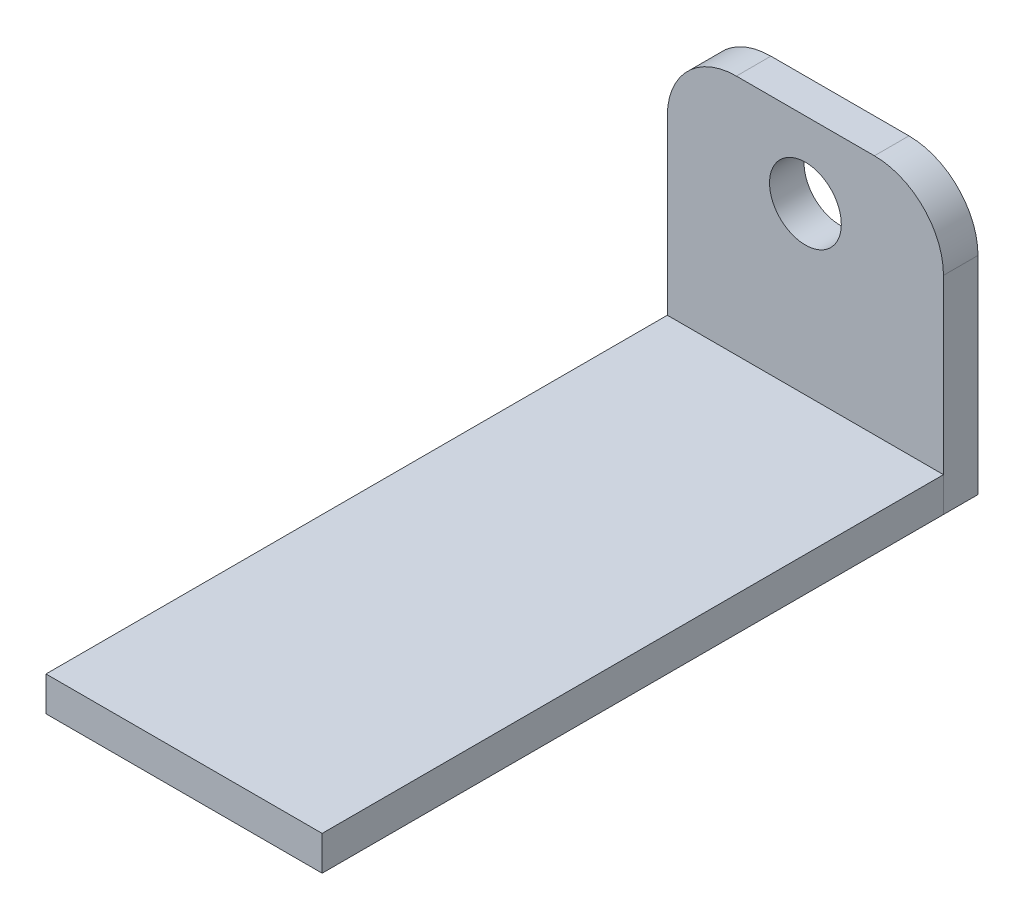
ISO-10303-21;
HEADER;
FILE_DESCRIPTION(('STEP AP214'),'2;1');
FILE_NAME('part.step','',(''),(''),'','','');
FILE_SCHEMA(('AUTOMOTIVE_DESIGN { 1 0 10303 214 1 1 1 1 }'));
ENDSEC;
DATA;
#1=APPLICATION_CONTEXT('core data for automotive mechanical design processes');
#2=APPLICATION_PROTOCOL_DEFINITION('international standard','automotive_design',2000,#1);
#3=PRODUCT_CONTEXT('',#1,'mechanical');
#4=PRODUCT('Part','Part','',(#3));
#5=PRODUCT_RELATED_PRODUCT_CATEGORY('part','',(#4));
#6=PRODUCT_DEFINITION_FORMATION('','',#4);
#7=PRODUCT_DEFINITION_CONTEXT('part definition',#1,'design');
#8=PRODUCT_DEFINITION('design','',#6,#7);
#9=PRODUCT_DEFINITION_SHAPE('','',#8);
#10=(LENGTH_UNIT() NAMED_UNIT(*) SI_UNIT(.MILLI.,.METRE.));
#11=(NAMED_UNIT(*) PLANE_ANGLE_UNIT() SI_UNIT($,.RADIAN.));
#12=(NAMED_UNIT(*) SI_UNIT($,.STERADIAN.) SOLID_ANGLE_UNIT());
#13=UNCERTAINTY_MEASURE_WITH_UNIT(LENGTH_MEASURE(1.E-05),#10,'distance_accuracy_value','');
#14=(GEOMETRIC_REPRESENTATION_CONTEXT(3) GLOBAL_UNCERTAINTY_ASSIGNED_CONTEXT((#13)) GLOBAL_UNIT_ASSIGNED_CONTEXT((#10,
#11,#12)) REPRESENTATION_CONTEXT('',''));
#15=CARTESIAN_POINT('',(0.,0.,0.));
#16=DIRECTION('',(0.,0.,1.));
#17=DIRECTION('',(1.,0.,0.));
#18=AXIS2_PLACEMENT_3D('',#15,#16,#17);
#19=CARTESIAN_POINT('',(19.05,0.,-60.325));
#20=DIRECTION('',(1.,0.,0.));
#21=DIRECTION('',(0.,0.,-1.));
#22=AXIS2_PLACEMENT_3D('',#19,#20,#21);
#23=PLANE('',#22);
#24=DIRECTION('',(0.,1.,0.));
#25=VECTOR('',#24,1.);
#26=CARTESIAN_POINT('',(19.05,0.,-57.15));
#27=LINE('',#26,#25);
#28=CARTESIAN_POINT('',(19.05,0.,-57.15));
#29=VERTEX_POINT('',#28);
#30=CARTESIAN_POINT('',(19.05,3.175,-57.15));
#31=VERTEX_POINT('',#30);
#32=EDGE_CURVE('E154',#29,#31,#27,.T.);
#33=ORIENTED_EDGE('',*,*,#32,.T.);
#34=DIRECTION('',(0.,0.,1.));
#35=VECTOR('',#34,1.);
#36=CARTESIAN_POINT('',(19.05,3.175,-60.325));
#37=LINE('',#36,#35);
#38=CARTESIAN_POINT('',(19.05,3.175,-60.325));
#39=VERTEX_POINT('',#38);
#40=EDGE_CURVE('E135',#39,#31,#37,.T.);
#41=ORIENTED_EDGE('',*,*,#40,.F.);
#42=DIRECTION('',(0.,1.,0.));
#43=VECTOR('',#42,1.);
#44=CARTESIAN_POINT('',(19.05,0.,-60.325));
#45=LINE('',#44,#43);
#46=CARTESIAN_POINT('',(19.05,0.,-60.325));
#47=VERTEX_POINT('',#46);
#48=EDGE_CURVE('E141',#47,#39,#45,.T.);
#49=ORIENTED_EDGE('',*,*,#48,.F.);
#50=DIRECTION('',(0.,0.,1.));
#51=VECTOR('',#50,1.);
#52=CARTESIAN_POINT('',(19.05,0.,-60.325));
#53=LINE('',#52,#51);
#54=EDGE_CURVE('E204',#47,#29,#53,.T.);
#55=ORIENTED_EDGE('',*,*,#54,.T.);
#56=EDGE_LOOP('',(#33,#41,#49,#55));
#57=FACE_BOUND('',#56,.T.);
#58=ADVANCED_FACE('F53',(#57),#23,.F.);
#59=CARTESIAN_POINT('',(0.,3.175,-60.325));
#60=DIRECTION('',(0.,1.,0.));
#61=DIRECTION('',(-1.,0.,0.));
#62=AXIS2_PLACEMENT_3D('',#59,#60,#61);
#63=PLANE('',#62);
#64=DIRECTION('',(-1.,0.,0.));
#65=VECTOR('',#64,1.);
#66=CARTESIAN_POINT('',(0.,3.175,-57.15));
#67=LINE('',#66,#65);
#68=CARTESIAN_POINT('',(6.35,3.175,-57.15));
#69=VERTEX_POINT('',#68);
#70=EDGE_CURVE('E221',#31,#69,#67,.T.);
#71=ORIENTED_EDGE('',*,*,#70,.T.);
#72=DIRECTION('',(0.,0.,1.));
#73=VECTOR('',#72,1.);
#74=CARTESIAN_POINT('',(6.35,3.175,-60.325));
#75=LINE('',#74,#73);
#76=CARTESIAN_POINT('',(6.35,3.175,-60.325));
#77=VERTEX_POINT('',#76);
#78=EDGE_CURVE('E138',#77,#69,#75,.T.);
#79=ORIENTED_EDGE('',*,*,#78,.F.);
#80=DIRECTION('',(-1.,0.,0.));
#81=VECTOR('',#80,1.);
#82=CARTESIAN_POINT('',(0.,3.175,-60.325));
#83=LINE('',#82,#81);
#84=EDGE_CURVE('E131',#39,#77,#83,.T.);
#85=ORIENTED_EDGE('',*,*,#84,.F.);
#86=ORIENTED_EDGE('',*,*,#40,.T.);
#87=EDGE_LOOP('',(#71,#79,#85,#86));
#88=FACE_BOUND('',#87,.T.);
#89=ADVANCED_FACE('F133',(#88),#63,.F.);
#90=CARTESIAN_POINT('',(6.35,0.,-60.325));
#91=DIRECTION('',(-1.,0.,0.));
#92=DIRECTION('',(0.,0.,1.));
#93=AXIS2_PLACEMENT_3D('',#90,#91,#92);
#94=PLANE('',#93);
#95=DIRECTION('',(0.,-1.,0.));
#96=VECTOR('',#95,1.);
#97=CARTESIAN_POINT('',(6.35,0.,-57.15));
#98=LINE('',#97,#96);
#99=CARTESIAN_POINT('',(6.35,0.,-57.15));
#100=VERTEX_POINT('',#99);
#101=EDGE_CURVE('E220',#69,#100,#98,.T.);
#102=ORIENTED_EDGE('',*,*,#101,.T.);
#103=DIRECTION('',(0.,0.,1.));
#104=VECTOR('',#103,1.);
#105=CARTESIAN_POINT('',(6.35,0.,-60.325));
#106=LINE('',#105,#104);
#107=CARTESIAN_POINT('',(6.35,0.,-60.325));
#108=VERTEX_POINT('',#107);
#109=EDGE_CURVE('E160',#108,#100,#106,.T.);
#110=ORIENTED_EDGE('',*,*,#109,.F.);
#111=DIRECTION('',(0.,-1.,0.));
#112=VECTOR('',#111,1.);
#113=CARTESIAN_POINT('',(6.35,0.,-60.325));
#114=LINE('',#113,#112);
#115=EDGE_CURVE('E140',#77,#108,#114,.T.);
#116=ORIENTED_EDGE('',*,*,#115,.F.);
#117=ORIENTED_EDGE('',*,*,#78,.T.);
#118=EDGE_LOOP('',(#102,#110,#116,#117));
#119=FACE_BOUND('',#118,.T.);
#120=ADVANCED_FACE('F260',(#119),#94,.F.);
#121=CARTESIAN_POINT('',(0.,0.,-60.325));
#122=DIRECTION('',(0.,1.,0.));
#123=DIRECTION('',(0.,0.,1.));
#124=AXIS2_PLACEMENT_3D('',#121,#122,#123);
#125=PLANE('',#124);
#126=DIRECTION('',(-1.,0.,0.));
#127=VECTOR('',#126,1.);
#128=CARTESIAN_POINT('',(0.,0.,-57.15));
#129=LINE('',#128,#127);
#130=CARTESIAN_POINT('',(0.,0.,-57.15));
#131=VERTEX_POINT('',#130);
#132=EDGE_CURVE('E199',#100,#131,#129,.T.);
#133=ORIENTED_EDGE('',*,*,#132,.T.);
#134=DIRECTION('',(0.,0.,1.));
#135=VECTOR('',#134,1.);
#136=CARTESIAN_POINT('',(0.,0.,-60.325));
#137=LINE('',#136,#135);
#138=CARTESIAN_POINT('',(0.,0.,-60.325));
#139=VERTEX_POINT('',#138);
#140=EDGE_CURVE('E207',#139,#131,#137,.T.);
#141=ORIENTED_EDGE('',*,*,#140,.F.);
#142=DIRECTION('',(-1.,0.,0.));
#143=VECTOR('',#142,1.);
#144=CARTESIAN_POINT('',(0.,0.,-60.325));
#145=LINE('',#144,#143);
#146=EDGE_CURVE('E216',#108,#139,#145,.T.);
#147=ORIENTED_EDGE('',*,*,#146,.F.);
#148=ORIENTED_EDGE('',*,*,#109,.T.);
#149=EDGE_LOOP('',(#133,#141,#147,#148));
#150=FACE_BOUND('',#149,.T.);
#151=ADVANCED_FACE('F214',(#150),#125,.F.);
#152=CARTESIAN_POINT('',(0.,0.,-60.325));
#153=DIRECTION('',(1.,0.,0.));
#154=DIRECTION('',(0.,0.,-1.));
#155=AXIS2_PLACEMENT_3D('',#152,#153,#154);
#156=PLANE('',#155);
#157=DIRECTION('',(0.,1.,0.));
#158=VECTOR('',#157,1.);
#159=CARTESIAN_POINT('',(0.,0.,-57.15));
#160=LINE('',#159,#158);
#161=CARTESIAN_POINT('',(0.,19.05,-57.15));
#162=VERTEX_POINT('',#161);
#163=EDGE_CURVE('E196',#131,#162,#160,.T.);
#164=ORIENTED_EDGE('',*,*,#163,.T.);
#165=DIRECTION('',(0.,0.,1.));
#166=VECTOR('',#165,1.);
#167=CARTESIAN_POINT('',(0.,19.05,-60.325));
#168=LINE('',#167,#166);
#169=CARTESIAN_POINT('',(0.,19.05,-60.325));
#170=VERTEX_POINT('',#169);
#171=EDGE_CURVE('E12',#162,#170,#168,.F.);
#172=ORIENTED_EDGE('',*,*,#171,.T.);
#173=DIRECTION('',(0.,1.,0.));
#174=VECTOR('',#173,1.);
#175=CARTESIAN_POINT('',(0.,0.,-60.325));
#176=LINE('',#175,#174);
#177=EDGE_CURVE('E229',#139,#170,#176,.T.);
#178=ORIENTED_EDGE('',*,*,#177,.F.);
#179=ORIENTED_EDGE('',*,*,#140,.T.);
#180=EDGE_LOOP('',(#164,#172,#178,#179));
#181=FACE_BOUND('',#180,.T.);
#182=ADVANCED_FACE('F269',(#181),#156,.F.);
#183=CARTESIAN_POINT('',(0.,25.4,-60.325));
#184=DIRECTION('',(0.,1.,0.));
#185=DIRECTION('',(0.,0.,1.));
#186=AXIS2_PLACEMENT_3D('',#183,#184,#185);
#187=PLANE('',#186);
#188=DIRECTION('',(-1.,0.,0.));
#189=VECTOR('',#188,1.);
#190=CARTESIAN_POINT('',(0.,25.4,-57.15));
#191=LINE('',#190,#189);
#192=CARTESIAN_POINT('',(19.05,25.4,-57.15));
#193=VERTEX_POINT('',#192);
#194=CARTESIAN_POINT('',(6.35,25.4,-57.15));
#195=VERTEX_POINT('',#194);
#196=EDGE_CURVE('E190',#193,#195,#191,.T.);
#197=ORIENTED_EDGE('',*,*,#196,.F.);
#198=DIRECTION('',(0.,0.,1.));
#199=VECTOR('',#198,1.);
#200=CARTESIAN_POINT('',(19.05,25.4,-60.325));
#201=LINE('',#200,#199);
#202=CARTESIAN_POINT('',(19.05,25.4,-60.325));
#203=VERTEX_POINT('',#202);
#204=EDGE_CURVE('E170',#193,#203,#201,.F.);
#205=ORIENTED_EDGE('',*,*,#204,.T.);
#206=DIRECTION('',(-1.,0.,0.));
#207=VECTOR('',#206,1.);
#208=CARTESIAN_POINT('',(0.,25.4,-60.325));
#209=LINE('',#208,#207);
#210=CARTESIAN_POINT('',(6.35,25.4,-60.325));
#211=VERTEX_POINT('',#210);
#212=EDGE_CURVE('E175',#203,#211,#209,.T.);
#213=ORIENTED_EDGE('',*,*,#212,.T.);
#214=DIRECTION('',(0.,0.,1.));
#215=VECTOR('',#214,1.);
#216=CARTESIAN_POINT('',(6.35,25.4,-57.15));
#217=LINE('',#216,#215);
#218=EDGE_CURVE('E167',#211,#195,#217,.T.);
#219=ORIENTED_EDGE('',*,*,#218,.T.);
#220=EDGE_LOOP('',(#197,#205,#213,#219));
#221=FACE_BOUND('',#220,.T.);
#222=ADVANCED_FACE('F194',(#221),#187,.T.);
#223=CARTESIAN_POINT('',(25.4,0.,-60.325));
#224=DIRECTION('',(1.,0.,0.));
#225=DIRECTION('',(0.,0.,-1.));
#226=AXIS2_PLACEMENT_3D('',#223,#224,#225);
#227=PLANE('',#226);
#228=DIRECTION('',(0.,1.,0.));
#229=VECTOR('',#228,1.);
#230=CARTESIAN_POINT('',(25.4,0.,-60.325));
#231=LINE('',#230,#229);
#232=CARTESIAN_POINT('',(25.4,0.,-60.325));
#233=VERTEX_POINT('',#232);
#234=CARTESIAN_POINT('',(25.4,19.05,-60.325));
#235=VERTEX_POINT('',#234);
#236=EDGE_CURVE('E174',#233,#235,#231,.T.);
#237=ORIENTED_EDGE('',*,*,#236,.T.);
#238=DIRECTION('',(0.,0.,1.));
#239=VECTOR('',#238,1.);
#240=CARTESIAN_POINT('',(25.4,19.05,-60.325));
#241=LINE('',#240,#239);
#242=CARTESIAN_POINT('',(25.4,19.05,-57.15));
#243=VERTEX_POINT('',#242);
#244=EDGE_CURVE('E155',#235,#243,#241,.T.);
#245=ORIENTED_EDGE('',*,*,#244,.T.);
#246=DIRECTION('',(0.,1.,0.));
#247=VECTOR('',#246,1.);
#248=CARTESIAN_POINT('',(25.4,0.,-57.15));
#249=LINE('',#248,#247);
#250=CARTESIAN_POINT('',(25.4,0.,-57.15));
#251=VERTEX_POINT('',#250);
#252=EDGE_CURVE('E192',#251,#243,#249,.T.);
#253=ORIENTED_EDGE('',*,*,#252,.F.);
#254=DIRECTION('',(0.,0.,1.));
#255=VECTOR('',#254,1.);
#256=CARTESIAN_POINT('',(25.4,0.,-60.325));
#257=LINE('',#256,#255);
#258=EDGE_CURVE('E183',#233,#251,#257,.T.);
#259=ORIENTED_EDGE('',*,*,#258,.F.);
#260=EDGE_LOOP('',(#237,#245,#253,#259));
#261=FACE_BOUND('',#260,.T.);
#262=ADVANCED_FACE('F180',(#261),#227,.T.);
#263=CARTESIAN_POINT('',(0.,0.,-60.325));
#264=DIRECTION('',(0.,1.,0.));
#265=DIRECTION('',(0.,0.,1.));
#266=AXIS2_PLACEMENT_3D('',#263,#264,#265);
#267=PLANE('',#266);
#268=DIRECTION('',(-1.,0.,0.));
#269=VECTOR('',#268,1.);
#270=CARTESIAN_POINT('',(0.,0.,-57.15));
#271=LINE('',#270,#269);
#272=EDGE_CURVE('E151',#251,#29,#271,.T.);
#273=ORIENTED_EDGE('',*,*,#272,.T.);
#274=ORIENTED_EDGE('',*,*,#54,.F.);
#275=DIRECTION('',(-1.,0.,0.));
#276=VECTOR('',#275,1.);
#277=CARTESIAN_POINT('',(0.,0.,-60.325));
#278=LINE('',#277,#276);
#279=EDGE_CURVE('E147',#233,#47,#278,.T.);
#280=ORIENTED_EDGE('',*,*,#279,.F.);
#281=ORIENTED_EDGE('',*,*,#258,.T.);
#282=EDGE_LOOP('',(#273,#274,#280,#281));
#283=FACE_BOUND('',#282,.T.);
#284=ADVANCED_FACE('F252',(#283),#267,.F.);
#285=CARTESIAN_POINT('',(0.,0.,-60.325));
#286=DIRECTION('',(0.,0.,-1.));
#287=DIRECTION('',(-1.,0.,0.));
#288=AXIS2_PLACEMENT_3D('',#285,#286,#287);
#289=PLANE('',#288);
#290=CARTESIAN_POINT('',(12.7,18.415,-60.325));
#291=DIRECTION('',(0.,0.,1.));
#292=DIRECTION('',(1.,0.,0.));
#293=AXIS2_PLACEMENT_3D('',#290,#291,#292);
#294=CIRCLE('',#293,3.302);
#295=CARTESIAN_POINT('',(16.002,18.415,-60.325));
#296=VERTEX_POINT('',#295);
#297=EDGE_CURVE('E226',#296,#296,#294,.T.);
#298=ORIENTED_EDGE('',*,*,#297,.T.);
#299=EDGE_LOOP('',(#298));
#300=FACE_BOUND('',#299,.T.);
#301=ORIENTED_EDGE('',*,*,#212,.F.);
#302=CARTESIAN_POINT('',(19.05,19.05,-60.325));
#303=DIRECTION('',(0.,0.,-1.));
#304=DIRECTION('',(-1.,0.,0.));
#305=AXIS2_PLACEMENT_3D('',#302,#303,#304);
#306=CIRCLE('',#305,6.35);
#307=EDGE_CURVE('E61',#203,#235,#306,.T.);
#308=ORIENTED_EDGE('',*,*,#307,.T.);
#309=ORIENTED_EDGE('',*,*,#236,.F.);
#310=ORIENTED_EDGE('',*,*,#279,.T.);
#311=ORIENTED_EDGE('',*,*,#48,.T.);
#312=ORIENTED_EDGE('',*,*,#84,.T.);
#313=ORIENTED_EDGE('',*,*,#115,.T.);
#314=ORIENTED_EDGE('',*,*,#146,.T.);
#315=ORIENTED_EDGE('',*,*,#177,.T.);
#316=CARTESIAN_POINT('',(6.35,19.05,-60.325));
#317=DIRECTION('',(0.,0.,-1.));
#318=DIRECTION('',(-1.,0.,0.));
#319=AXIS2_PLACEMENT_3D('',#316,#317,#318);
#320=CIRCLE('',#319,6.35);
#321=EDGE_CURVE('E73',#170,#211,#320,.T.);
#322=ORIENTED_EDGE('',*,*,#321,.T.);
#323=EDGE_LOOP('',(#301,#308,#309,#310,#311,#312,#313,#314,#315,#322));
#324=FACE_BOUND('',#323,.T.);
#325=ADVANCED_FACE('F144',(#300,#324),#289,.T.);
#326=CARTESIAN_POINT('',(0.,0.,-57.15));
#327=DIRECTION('',(0.,0.,-1.));
#328=DIRECTION('',(-1.,0.,0.));
#329=AXIS2_PLACEMENT_3D('',#326,#327,#328);
#330=PLANE('',#329);
#331=CARTESIAN_POINT('',(12.7,18.415,-57.15));
#332=DIRECTION('',(0.,0.,1.));
#333=DIRECTION('',(1.,0.,0.));
#334=AXIS2_PLACEMENT_3D('',#331,#332,#333);
#335=CIRCLE('',#334,3.302);
#336=CARTESIAN_POINT('',(16.002,18.415,-57.15));
#337=VERTEX_POINT('',#336);
#338=EDGE_CURVE('E233',#337,#337,#335,.T.);
#339=ORIENTED_EDGE('',*,*,#338,.F.);
#340=EDGE_LOOP('',(#339));
#341=FACE_BOUND('',#340,.T.);
#342=ORIENTED_EDGE('',*,*,#252,.T.);
#343=CARTESIAN_POINT('',(19.05,19.05,-57.15));
#344=DIRECTION('',(0.,0.,-1.));
#345=DIRECTION('',(-1.,0.,0.));
#346=AXIS2_PLACEMENT_3D('',#343,#344,#345);
#347=CIRCLE('',#346,6.35);
#348=EDGE_CURVE('E165',#243,#193,#347,.F.);
#349=ORIENTED_EDGE('',*,*,#348,.T.);
#350=ORIENTED_EDGE('',*,*,#196,.T.);
#351=CARTESIAN_POINT('',(6.35,19.05,-57.15));
#352=DIRECTION('',(0.,0.,-1.));
#353=DIRECTION('',(-1.,0.,0.));
#354=AXIS2_PLACEMENT_3D('',#351,#352,#353);
#355=CIRCLE('',#354,6.35);
#356=EDGE_CURVE('E158',#195,#162,#355,.F.);
#357=ORIENTED_EDGE('',*,*,#356,.T.);
#358=ORIENTED_EDGE('',*,*,#163,.F.);
#359=ORIENTED_EDGE('',*,*,#132,.F.);
#360=ORIENTED_EDGE('',*,*,#101,.F.);
#361=ORIENTED_EDGE('',*,*,#70,.F.);
#362=ORIENTED_EDGE('',*,*,#32,.F.);
#363=ORIENTED_EDGE('',*,*,#272,.F.);
#364=EDGE_LOOP('',(#342,#349,#350,#357,#358,#359,#360,#361,#362,#363));
#365=FACE_BOUND('',#364,.T.);
#366=ADVANCED_FACE('F189',(#341,#365),#330,.F.);
#367=CARTESIAN_POINT('',(12.7,18.415,-60.325));
#368=DIRECTION('',(0.,0.,1.));
#369=DIRECTION('',(1.,0.,0.));
#370=AXIS2_PLACEMENT_3D('',#367,#368,#369);
#371=CYLINDRICAL_SURFACE('',#370,3.302);
#372=ORIENTED_EDGE('',*,*,#297,.F.);
#373=EDGE_LOOP('',(#372));
#374=FACE_BOUND('',#373,.T.);
#375=ORIENTED_EDGE('',*,*,#338,.T.);
#376=EDGE_LOOP('',(#375));
#377=FACE_BOUND('',#376,.T.);
#378=ADVANCED_FACE('F240',(#374,#377),#371,.F.);
#379=CARTESIAN_POINT('',(19.05,19.05,-60.325));
#380=DIRECTION('',(0.,0.,1.));
#381=DIRECTION('',(1.,0.,0.));
#382=AXIS2_PLACEMENT_3D('',#379,#380,#381);
#383=CYLINDRICAL_SURFACE('',#382,6.35);
#384=ORIENTED_EDGE('',*,*,#307,.F.);
#385=ORIENTED_EDGE('',*,*,#204,.F.);
#386=ORIENTED_EDGE('',*,*,#348,.F.);
#387=ORIENTED_EDGE('',*,*,#244,.F.);
#388=EDGE_LOOP('',(#384,#385,#386,#387));
#389=FACE_BOUND('',#388,.T.);
#390=ADVANCED_FACE('F185',(#389),#383,.T.);
#391=CARTESIAN_POINT('',(6.35,19.05,-60.325));
#392=DIRECTION('',(0.,0.,-1.));
#393=DIRECTION('',(-1.,0.,0.));
#394=AXIS2_PLACEMENT_3D('',#391,#392,#393);
#395=CYLINDRICAL_SURFACE('',#394,6.35);
#396=ORIENTED_EDGE('',*,*,#321,.F.);
#397=ORIENTED_EDGE('',*,*,#171,.F.);
#398=ORIENTED_EDGE('',*,*,#356,.F.);
#399=ORIENTED_EDGE('',*,*,#218,.F.);
#400=EDGE_LOOP('',(#396,#397,#398,#399));
#401=FACE_BOUND('',#400,.T.);
#402=ADVANCED_FACE('F55',(#401),#395,.T.);
#403=CLOSED_SHELL('',(#58,#89,#120,#151,#182,#222,#262,#284,#325,#366,#378,#390,#402));
#404=MANIFOLD_SOLID_BREP('B2',#403);
#405=CARTESIAN_POINT('',(0.,3.175,0.));
#406=DIRECTION('',(0.,0.,-1.));
#407=DIRECTION('',(-1.,0.,0.));
#408=AXIS2_PLACEMENT_3D('',#405,#406,#407);
#409=PLANE('',#408);
#410=DIRECTION('',(1.,0.,0.));
#411=VECTOR('',#410,1.);
#412=CARTESIAN_POINT('',(0.,0.,0.));
#413=LINE('',#412,#411);
#414=CARTESIAN_POINT('',(0.,0.,0.));
#415=VERTEX_POINT('',#414);
#416=CARTESIAN_POINT('',(25.4,0.,0.));
#417=VERTEX_POINT('',#416);
#418=EDGE_CURVE('E495',#415,#417,#413,.T.);
#419=ORIENTED_EDGE('',*,*,#418,.T.);
#420=DIRECTION('',(0.,-1.,0.));
#421=VECTOR('',#420,1.);
#422=CARTESIAN_POINT('',(25.4,3.175,0.));
#423=LINE('',#422,#421);
#424=CARTESIAN_POINT('',(25.4,3.175,0.));
#425=VERTEX_POINT('',#424);
#426=EDGE_CURVE('E51',#425,#417,#423,.T.);
#427=ORIENTED_EDGE('',*,*,#426,.F.);
#428=DIRECTION('',(1.,0.,0.));
#429=VECTOR('',#428,1.);
#430=CARTESIAN_POINT('',(0.,3.175,0.));
#431=LINE('',#430,#429);
#432=CARTESIAN_POINT('',(0.,3.175,0.));
#433=VERTEX_POINT('',#432);
#434=EDGE_CURVE('E470',#433,#425,#431,.T.);
#435=ORIENTED_EDGE('',*,*,#434,.F.);
#436=DIRECTION('',(0.,-1.,0.));
#437=VECTOR('',#436,1.);
#438=CARTESIAN_POINT('',(0.,3.175,0.));
#439=LINE('',#438,#437);
#440=EDGE_CURVE('E385',#433,#415,#439,.T.);
#441=ORIENTED_EDGE('',*,*,#440,.T.);
#442=EDGE_LOOP('',(#419,#427,#435,#441));
#443=FACE_BOUND('',#442,.T.);
#444=ADVANCED_FACE('F369',(#443),#409,.F.);
#445=CARTESIAN_POINT('',(25.4,3.175,0.));
#446=DIRECTION('',(-1.,0.,0.));
#447=DIRECTION('',(0.,0.,1.));
#448=AXIS2_PLACEMENT_3D('',#445,#446,#447);
#449=PLANE('',#448);
#450=DIRECTION('',(0.,0.,-1.));
#451=VECTOR('',#450,1.);
#452=CARTESIAN_POINT('',(25.4,0.,0.));
#453=LINE('',#452,#451);
#454=CARTESIAN_POINT('',(25.4,0.,-57.15));
#455=VERTEX_POINT('',#454);
#456=EDGE_CURVE('E493',#417,#455,#453,.T.);
#457=ORIENTED_EDGE('',*,*,#456,.T.);
#458=DIRECTION('',(0.,-1.,0.));
#459=VECTOR('',#458,1.);
#460=CARTESIAN_POINT('',(25.4,3.175,-57.15));
#461=LINE('',#460,#459);
#462=CARTESIAN_POINT('',(25.4,3.175,-57.15));
#463=VERTEX_POINT('',#462);
#464=EDGE_CURVE('E377',#463,#455,#461,.T.);
#465=ORIENTED_EDGE('',*,*,#464,.F.);
#466=DIRECTION('',(0.,0.,-1.));
#467=VECTOR('',#466,1.);
#468=CARTESIAN_POINT('',(25.4,3.175,0.));
#469=LINE('',#468,#467);
#470=EDGE_CURVE('E423',#425,#463,#469,.T.);
#471=ORIENTED_EDGE('',*,*,#470,.F.);
#472=ORIENTED_EDGE('',*,*,#426,.T.);
#473=EDGE_LOOP('',(#457,#465,#471,#472));
#474=FACE_BOUND('',#473,.T.);
#475=ADVANCED_FACE('F494',(#474),#449,.F.);
#476=CARTESIAN_POINT('',(0.,3.175,-57.15));
#477=DIRECTION('',(0.,0.,-1.));
#478=DIRECTION('',(-1.,0.,0.));
#479=AXIS2_PLACEMENT_3D('',#476,#477,#478);
#480=PLANE('',#479);
#481=DIRECTION('',(1.,0.,0.));
#482=VECTOR('',#481,1.);
#483=CARTESIAN_POINT('',(0.,0.,-57.15));
#484=LINE('',#483,#482);
#485=CARTESIAN_POINT('',(18.923,0.,-57.15));
#486=VERTEX_POINT('',#485);
#487=EDGE_CURVE('E479',#486,#455,#484,.T.);
#488=ORIENTED_EDGE('',*,*,#487,.F.);
#489=DIRECTION('',(0.,-1.,0.));
#490=VECTOR('',#489,1.);
#491=CARTESIAN_POINT('',(18.923,3.175,-57.15));
#492=LINE('',#491,#490);
#493=CARTESIAN_POINT('',(18.923,3.175,-57.15));
#494=VERTEX_POINT('',#493);
#495=EDGE_CURVE('E488',#494,#486,#492,.T.);
#496=ORIENTED_EDGE('',*,*,#495,.F.);
#497=DIRECTION('',(1.,0.,0.));
#498=VECTOR('',#497,1.);
#499=CARTESIAN_POINT('',(0.,3.175,-57.15));
#500=LINE('',#499,#498);
#501=EDGE_CURVE('E462',#494,#463,#500,.T.);
#502=ORIENTED_EDGE('',*,*,#501,.T.);
#503=ORIENTED_EDGE('',*,*,#464,.T.);
#504=EDGE_LOOP('',(#488,#496,#502,#503));
#505=FACE_BOUND('',#504,.T.);
#506=ADVANCED_FACE('F491',(#505),#480,.T.);
#507=CARTESIAN_POINT('',(18.923,3.175,0.));
#508=DIRECTION('',(-1.,0.,0.));
#509=DIRECTION('',(0.,0.,1.));
#510=AXIS2_PLACEMENT_3D('',#507,#508,#509);
#511=PLANE('',#510);
#512=DIRECTION('',(0.,0.,-1.));
#513=VECTOR('',#512,1.);
#514=CARTESIAN_POINT('',(18.923,0.,0.));
#515=LINE('',#514,#513);
#516=CARTESIAN_POINT('',(18.923,0.,-60.325));
#517=VERTEX_POINT('',#516);
#518=EDGE_CURVE('E501',#486,#517,#515,.T.);
#519=ORIENTED_EDGE('',*,*,#518,.T.);
#520=DIRECTION('',(0.,-1.,0.));
#521=VECTOR('',#520,1.);
#522=CARTESIAN_POINT('',(18.923,3.175,-60.325));
#523=LINE('',#522,#521);
#524=CARTESIAN_POINT('',(18.923,3.175,-60.325));
#525=VERTEX_POINT('',#524);
#526=EDGE_CURVE('E486',#525,#517,#523,.T.);
#527=ORIENTED_EDGE('',*,*,#526,.F.);
#528=DIRECTION('',(0.,0.,-1.));
#529=VECTOR('',#528,1.);
#530=CARTESIAN_POINT('',(18.923,3.175,0.));
#531=LINE('',#530,#529);
#532=EDGE_CURVE('E467',#494,#525,#531,.T.);
#533=ORIENTED_EDGE('',*,*,#532,.F.);
#534=ORIENTED_EDGE('',*,*,#495,.T.);
#535=EDGE_LOOP('',(#519,#527,#533,#534));
#536=FACE_BOUND('',#535,.T.);
#537=ADVANCED_FACE('F511',(#536),#511,.F.);
#538=CARTESIAN_POINT('',(0.,3.175,-60.325));
#539=DIRECTION('',(0.,0.,-1.));
#540=DIRECTION('',(-1.,0.,0.));
#541=AXIS2_PLACEMENT_3D('',#538,#539,#540);
#542=PLANE('',#541);
#543=DIRECTION('',(1.,0.,0.));
#544=VECTOR('',#543,1.);
#545=CARTESIAN_POINT('',(0.,0.,-60.325));
#546=LINE('',#545,#544);
#547=CARTESIAN_POINT('',(6.477,0.,-60.325));
#548=VERTEX_POINT('',#547);
#549=EDGE_CURVE('E502',#548,#517,#546,.T.);
#550=ORIENTED_EDGE('',*,*,#549,.F.);
#551=DIRECTION('',(0.,-1.,0.));
#552=VECTOR('',#551,1.);
#553=CARTESIAN_POINT('',(6.477,3.175,-60.325));
#554=LINE('',#553,#552);
#555=CARTESIAN_POINT('',(6.477,3.175,-60.325));
#556=VERTEX_POINT('',#555);
#557=EDGE_CURVE('E448',#556,#548,#554,.T.);
#558=ORIENTED_EDGE('',*,*,#557,.F.);
#559=DIRECTION('',(1.,0.,0.));
#560=VECTOR('',#559,1.);
#561=CARTESIAN_POINT('',(0.,3.175,-60.325));
#562=LINE('',#561,#560);
#563=EDGE_CURVE('E457',#556,#525,#562,.T.);
#564=ORIENTED_EDGE('',*,*,#563,.T.);
#565=ORIENTED_EDGE('',*,*,#526,.T.);
#566=EDGE_LOOP('',(#550,#558,#564,#565));
#567=FACE_BOUND('',#566,.T.);
#568=ADVANCED_FACE('F507',(#567),#542,.T.);
#569=CARTESIAN_POINT('',(6.477,3.175,0.));
#570=DIRECTION('',(-1.,0.,0.));
#571=DIRECTION('',(0.,0.,1.));
#572=AXIS2_PLACEMENT_3D('',#569,#570,#571);
#573=PLANE('',#572);
#574=DIRECTION('',(0.,0.,-1.));
#575=VECTOR('',#574,1.);
#576=CARTESIAN_POINT('',(6.477,0.,0.));
#577=LINE('',#576,#575);
#578=CARTESIAN_POINT('',(6.477,0.,-57.15));
#579=VERTEX_POINT('',#578);
#580=EDGE_CURVE('E444',#579,#548,#577,.T.);
#581=ORIENTED_EDGE('',*,*,#580,.F.);
#582=DIRECTION('',(0.,-1.,0.));
#583=VECTOR('',#582,1.);
#584=CARTESIAN_POINT('',(6.477,3.175,-57.15));
#585=LINE('',#584,#583);
#586=CARTESIAN_POINT('',(6.477,3.175,-57.15));
#587=VERTEX_POINT('',#586);
#588=EDGE_CURVE('E439',#587,#579,#585,.T.);
#589=ORIENTED_EDGE('',*,*,#588,.F.);
#590=DIRECTION('',(0.,0.,-1.));
#591=VECTOR('',#590,1.);
#592=CARTESIAN_POINT('',(6.477,3.175,0.));
#593=LINE('',#592,#591);
#594=EDGE_CURVE('E442',#587,#556,#593,.T.);
#595=ORIENTED_EDGE('',*,*,#594,.T.);
#596=ORIENTED_EDGE('',*,*,#557,.T.);
#597=EDGE_LOOP('',(#581,#589,#595,#596));
#598=FACE_BOUND('',#597,.T.);
#599=ADVANCED_FACE('F441',(#598),#573,.T.);
#600=CARTESIAN_POINT('',(0.,0.,-57.15));
#601=VERTEX_POINT('',#600);
#602=EDGE_CURVE('E475',#601,#579,#484,.T.);
#603=ORIENTED_EDGE('',*,*,#602,.F.);
#604=DIRECTION('',(0.,-1.,0.));
#605=VECTOR('',#604,1.);
#606=CARTESIAN_POINT('',(0.,3.175,-57.15));
#607=LINE('',#606,#605);
#608=CARTESIAN_POINT('',(0.,3.175,-57.15));
#609=VERTEX_POINT('',#608);
#610=EDGE_CURVE('E411',#609,#601,#607,.T.);
#611=ORIENTED_EDGE('',*,*,#610,.F.);
#612=EDGE_CURVE('E455',#609,#587,#500,.T.);
#613=ORIENTED_EDGE('',*,*,#612,.T.);
#614=ORIENTED_EDGE('',*,*,#588,.T.);
#615=EDGE_LOOP('',(#603,#611,#613,#614));
#616=FACE_BOUND('',#615,.T.);
#617=ADVANCED_FACE('F459',(#616),#480,.T.);
#618=CARTESIAN_POINT('',(0.,3.175,0.));
#619=DIRECTION('',(-1.,0.,0.));
#620=DIRECTION('',(0.,0.,1.));
#621=AXIS2_PLACEMENT_3D('',#618,#619,#620);
#622=PLANE('',#621);
#623=DIRECTION('',(0.,0.,-1.));
#624=VECTOR('',#623,1.);
#625=CARTESIAN_POINT('',(0.,0.,0.));
#626=LINE('',#625,#624);
#627=EDGE_CURVE('E471',#415,#601,#626,.T.);
#628=ORIENTED_EDGE('',*,*,#627,.F.);
#629=ORIENTED_EDGE('',*,*,#440,.F.);
#630=DIRECTION('',(0.,0.,-1.));
#631=VECTOR('',#630,1.);
#632=CARTESIAN_POINT('',(0.,3.175,0.));
#633=LINE('',#632,#631);
#634=EDGE_CURVE('E460',#433,#609,#633,.T.);
#635=ORIENTED_EDGE('',*,*,#634,.T.);
#636=ORIENTED_EDGE('',*,*,#610,.T.);
#637=EDGE_LOOP('',(#628,#629,#635,#636));
#638=FACE_BOUND('',#637,.T.);
#639=ADVANCED_FACE('F525',(#638),#622,.T.);
#640=CARTESIAN_POINT('',(0.,3.175,0.));
#641=DIRECTION('',(0.,1.,0.));
#642=DIRECTION('',(0.,0.,1.));
#643=AXIS2_PLACEMENT_3D('',#640,#641,#642);
#644=PLANE('',#643);
#645=ORIENTED_EDGE('',*,*,#434,.T.);
#646=ORIENTED_EDGE('',*,*,#470,.T.);
#647=ORIENTED_EDGE('',*,*,#501,.F.);
#648=ORIENTED_EDGE('',*,*,#532,.T.);
#649=ORIENTED_EDGE('',*,*,#563,.F.);
#650=ORIENTED_EDGE('',*,*,#594,.F.);
#651=ORIENTED_EDGE('',*,*,#612,.F.);
#652=ORIENTED_EDGE('',*,*,#634,.F.);
#653=EDGE_LOOP('',(#645,#646,#647,#648,#649,#650,#651,#652));
#654=FACE_BOUND('',#653,.T.);
#655=ADVANCED_FACE('F453',(#654),#644,.T.);
#656=CARTESIAN_POINT('',(0.,0.,0.));
#657=DIRECTION('',(0.,1.,0.));
#658=DIRECTION('',(0.,0.,1.));
#659=AXIS2_PLACEMENT_3D('',#656,#657,#658);
#660=PLANE('',#659);
#661=ORIENTED_EDGE('',*,*,#418,.F.);
#662=ORIENTED_EDGE('',*,*,#627,.T.);
#663=ORIENTED_EDGE('',*,*,#602,.T.);
#664=ORIENTED_EDGE('',*,*,#580,.T.);
#665=ORIENTED_EDGE('',*,*,#549,.T.);
#666=ORIENTED_EDGE('',*,*,#518,.F.);
#667=ORIENTED_EDGE('',*,*,#487,.T.);
#668=ORIENTED_EDGE('',*,*,#456,.F.);
#669=EDGE_LOOP('',(#661,#662,#663,#664,#665,#666,#667,#668));
#670=FACE_BOUND('',#669,.T.);
#671=ADVANCED_FACE('F498',(#670),#660,.F.);
#672=CLOSED_SHELL('',(#444,#475,#506,#537,#568,#599,#617,#639,#655,#671));
#673=MANIFOLD_SOLID_BREP('B6',#672);
#674=ADVANCED_BREP_SHAPE_REPRESENTATION('',(#18,#404,#673),#14);
#675=SHAPE_DEFINITION_REPRESENTATION(#9,#674);
ENDSEC;
END-ISO-10303-21;
